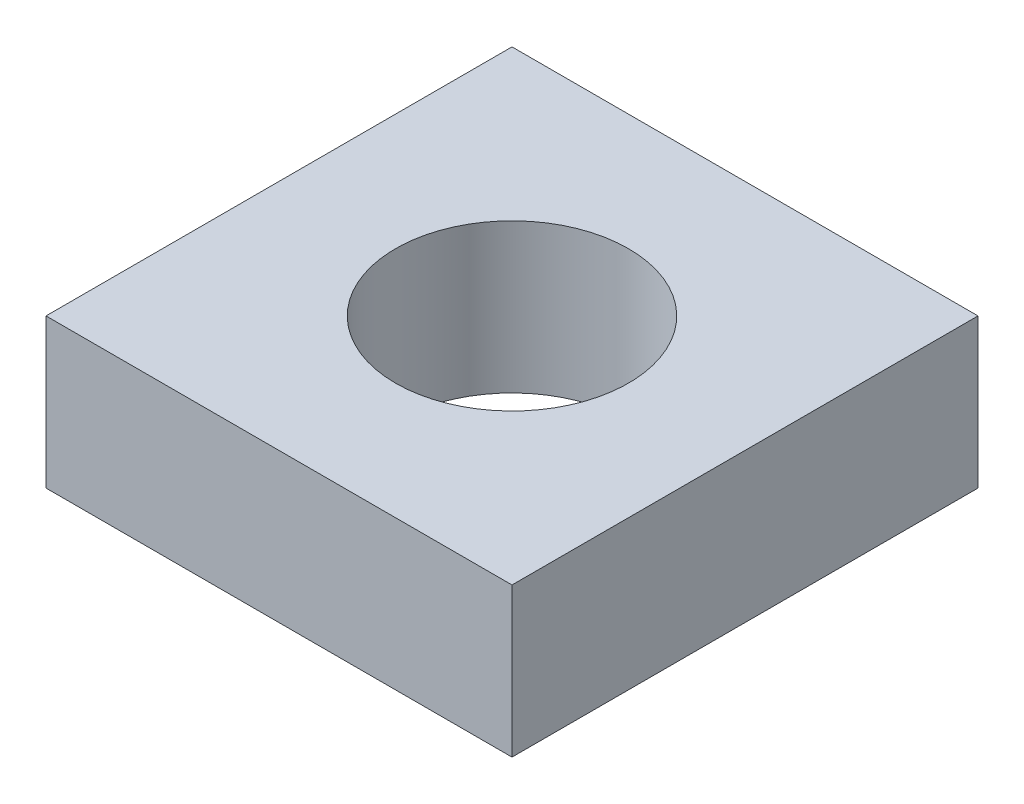
ISO-10303-21;
HEADER;
FILE_DESCRIPTION(('STEP AP214'),'2;1');
FILE_NAME('part.step','',(''),(''),'','','');
FILE_SCHEMA(('AUTOMOTIVE_DESIGN { 1 0 10303 214 1 1 1 1 }'));
ENDSEC;
DATA;
#1=APPLICATION_CONTEXT('core data for automotive mechanical design processes');
#2=APPLICATION_PROTOCOL_DEFINITION('international standard','automotive_design',2000,#1);
#3=PRODUCT_CONTEXT('',#1,'mechanical');
#4=PRODUCT('Part','Part','',(#3));
#5=PRODUCT_RELATED_PRODUCT_CATEGORY('part','',(#4));
#6=PRODUCT_DEFINITION_FORMATION('','',#4);
#7=PRODUCT_DEFINITION_CONTEXT('part definition',#1,'design');
#8=PRODUCT_DEFINITION('design','',#6,#7);
#9=PRODUCT_DEFINITION_SHAPE('','',#8);
#10=(LENGTH_UNIT() NAMED_UNIT(*) SI_UNIT(.MILLI.,.METRE.));
#11=(NAMED_UNIT(*) PLANE_ANGLE_UNIT() SI_UNIT($,.RADIAN.));
#12=(NAMED_UNIT(*) SI_UNIT($,.STERADIAN.) SOLID_ANGLE_UNIT());
#13=UNCERTAINTY_MEASURE_WITH_UNIT(LENGTH_MEASURE(1.E-05),#10,'distance_accuracy_value','');
#14=(GEOMETRIC_REPRESENTATION_CONTEXT(3) GLOBAL_UNCERTAINTY_ASSIGNED_CONTEXT((#13)) GLOBAL_UNIT_ASSIGNED_CONTEXT((#10,
#11,#12)) REPRESENTATION_CONTEXT('',''));
#15=CARTESIAN_POINT('',(0.,0.,0.));
#16=DIRECTION('',(0.,0.,1.));
#17=DIRECTION('',(1.,0.,0.));
#18=AXIS2_PLACEMENT_3D('',#15,#16,#17);
#19=CARTESIAN_POINT('',(0.,1.6,0.));
#20=DIRECTION('',(0.,1.,0.));
#21=DIRECTION('',(0.,0.,1.));
#22=AXIS2_PLACEMENT_3D('',#19,#20,#21);
#23=PLANE('',#22);
#24=DIRECTION('',(0.,0.,1.));
#25=VECTOR('',#24,1.);
#26=CARTESIAN_POINT('',(-2.5,1.6,2.5));
#27=LINE('',#26,#25);
#28=CARTESIAN_POINT('',(-2.5,1.6,-2.5));
#29=VERTEX_POINT('',#28);
#30=CARTESIAN_POINT('',(-2.5,1.6,2.5));
#31=VERTEX_POINT('',#30);
#32=EDGE_CURVE('E85',#29,#31,#27,.T.);
#33=ORIENTED_EDGE('',*,*,#32,.T.);
#34=DIRECTION('',(1.,0.,0.));
#35=VECTOR('',#34,1.);
#36=CARTESIAN_POINT('',(2.5,1.6,2.5));
#37=LINE('',#36,#35);
#38=CARTESIAN_POINT('',(2.5,1.6,2.5));
#39=VERTEX_POINT('',#38);
#40=EDGE_CURVE('E80',#31,#39,#37,.T.);
#41=ORIENTED_EDGE('',*,*,#40,.T.);
#42=DIRECTION('',(0.,0.,-1.));
#43=VECTOR('',#42,1.);
#44=CARTESIAN_POINT('',(2.5,1.6,2.5));
#45=LINE('',#44,#43);
#46=CARTESIAN_POINT('',(2.5,1.6,-2.5));
#47=VERTEX_POINT('',#46);
#48=EDGE_CURVE('E83',#39,#47,#45,.T.);
#49=ORIENTED_EDGE('',*,*,#48,.T.);
#50=DIRECTION('',(-1.,0.,0.));
#51=VECTOR('',#50,1.);
#52=CARTESIAN_POINT('',(2.5,1.6,-2.5));
#53=LINE('',#52,#51);
#54=EDGE_CURVE('E50',#47,#29,#53,.T.);
#55=ORIENTED_EDGE('',*,*,#54,.T.);
#56=EDGE_LOOP('',(#33,#41,#49,#55));
#57=FACE_BOUND('',#56,.T.);
#58=CARTESIAN_POINT('',(0.,1.6,0.));
#59=DIRECTION('',(0.,1.,0.));
#60=DIRECTION('',(0.,0.,1.));
#61=AXIS2_PLACEMENT_3D('',#58,#59,#60);
#62=CIRCLE('',#61,1.25);
#63=CARTESIAN_POINT('',(0.,1.6,1.25));
#64=VERTEX_POINT('',#63);
#65=EDGE_CURVE('E100',#64,#64,#62,.T.);
#66=ORIENTED_EDGE('',*,*,#65,.F.);
#67=EDGE_LOOP('',(#66));
#68=FACE_BOUND('',#67,.T.);
#69=ADVANCED_FACE('F33',(#57,#68),#23,.T.);
#70=CARTESIAN_POINT('',(0.,0.,0.));
#71=DIRECTION('',(0.,1.,0.));
#72=DIRECTION('',(0.,0.,1.));
#73=AXIS2_PLACEMENT_3D('',#70,#71,#72);
#74=PLANE('',#73);
#75=DIRECTION('',(0.,0.,1.));
#76=VECTOR('',#75,1.);
#77=CARTESIAN_POINT('',(-2.5,0.,2.5));
#78=LINE('',#77,#76);
#79=CARTESIAN_POINT('',(-2.5,0.,-2.5));
#80=VERTEX_POINT('',#79);
#81=CARTESIAN_POINT('',(-2.5,0.,2.5));
#82=VERTEX_POINT('',#81);
#83=EDGE_CURVE('E97',#80,#82,#78,.T.);
#84=ORIENTED_EDGE('',*,*,#83,.F.);
#85=DIRECTION('',(-1.,0.,0.));
#86=VECTOR('',#85,1.);
#87=CARTESIAN_POINT('',(2.5,0.,-2.5));
#88=LINE('',#87,#86);
#89=CARTESIAN_POINT('',(2.5,0.,-2.5));
#90=VERTEX_POINT('',#89);
#91=EDGE_CURVE('E73',#90,#80,#88,.T.);
#92=ORIENTED_EDGE('',*,*,#91,.F.);
#93=DIRECTION('',(0.,0.,-1.));
#94=VECTOR('',#93,1.);
#95=CARTESIAN_POINT('',(2.5,0.,2.5));
#96=LINE('',#95,#94);
#97=CARTESIAN_POINT('',(2.5,0.,2.5));
#98=VERTEX_POINT('',#97);
#99=EDGE_CURVE('E67',#98,#90,#96,.T.);
#100=ORIENTED_EDGE('',*,*,#99,.F.);
#101=DIRECTION('',(1.,0.,0.));
#102=VECTOR('',#101,1.);
#103=CARTESIAN_POINT('',(2.5,0.,2.5));
#104=LINE('',#103,#102);
#105=EDGE_CURVE('E89',#82,#98,#104,.T.);
#106=ORIENTED_EDGE('',*,*,#105,.F.);
#107=EDGE_LOOP('',(#84,#92,#100,#106));
#108=FACE_BOUND('',#107,.T.);
#109=CARTESIAN_POINT('',(0.,0.,0.));
#110=DIRECTION('',(0.,1.,0.));
#111=DIRECTION('',(0.,0.,1.));
#112=AXIS2_PLACEMENT_3D('',#109,#110,#111);
#113=CIRCLE('',#112,1.25);
#114=CARTESIAN_POINT('',(0.,0.,1.25));
#115=VERTEX_POINT('',#114);
#116=EDGE_CURVE('E112',#115,#115,#113,.T.);
#117=ORIENTED_EDGE('',*,*,#116,.T.);
#118=EDGE_LOOP('',(#117));
#119=FACE_BOUND('',#118,.T.);
#120=ADVANCED_FACE('F108',(#108,#119),#74,.F.);
#121=CARTESIAN_POINT('',(-2.5,1.6,2.5));
#122=DIRECTION('',(1.,0.,0.));
#123=DIRECTION('',(0.,0.,-1.));
#124=AXIS2_PLACEMENT_3D('',#121,#122,#123);
#125=PLANE('',#124);
#126=ORIENTED_EDGE('',*,*,#83,.T.);
#127=DIRECTION('',(0.,-1.,0.));
#128=VECTOR('',#127,1.);
#129=CARTESIAN_POINT('',(-2.5,1.6,2.5));
#130=LINE('',#129,#128);
#131=EDGE_CURVE('E11',#31,#82,#130,.T.);
#132=ORIENTED_EDGE('',*,*,#131,.F.);
#133=ORIENTED_EDGE('',*,*,#32,.F.);
#134=DIRECTION('',(0.,-1.,0.));
#135=VECTOR('',#134,1.);
#136=CARTESIAN_POINT('',(-2.5,1.6,-2.5));
#137=LINE('',#136,#135);
#138=EDGE_CURVE('E93',#29,#80,#137,.T.);
#139=ORIENTED_EDGE('',*,*,#138,.T.);
#140=EDGE_LOOP('',(#126,#132,#133,#139));
#141=FACE_BOUND('',#140,.T.);
#142=ADVANCED_FACE('F35',(#141),#125,.F.);
#143=CARTESIAN_POINT('',(2.5,1.6,2.5));
#144=DIRECTION('',(0.,0.,-1.));
#145=DIRECTION('',(-1.,0.,0.));
#146=AXIS2_PLACEMENT_3D('',#143,#144,#145);
#147=PLANE('',#146);
#148=ORIENTED_EDGE('',*,*,#105,.T.);
#149=DIRECTION('',(0.,-1.,0.));
#150=VECTOR('',#149,1.);
#151=CARTESIAN_POINT('',(2.5,1.6,2.5));
#152=LINE('',#151,#150);
#153=EDGE_CURVE('E42',#39,#98,#152,.T.);
#154=ORIENTED_EDGE('',*,*,#153,.F.);
#155=ORIENTED_EDGE('',*,*,#40,.F.);
#156=ORIENTED_EDGE('',*,*,#131,.T.);
#157=EDGE_LOOP('',(#148,#154,#155,#156));
#158=FACE_BOUND('',#157,.T.);
#159=ADVANCED_FACE('F88',(#158),#147,.F.);
#160=CARTESIAN_POINT('',(2.5,1.6,2.5));
#161=DIRECTION('',(-1.,0.,0.));
#162=DIRECTION('',(0.,0.,1.));
#163=AXIS2_PLACEMENT_3D('',#160,#161,#162);
#164=PLANE('',#163);
#165=ORIENTED_EDGE('',*,*,#99,.T.);
#166=DIRECTION('',(0.,-1.,0.));
#167=VECTOR('',#166,1.);
#168=CARTESIAN_POINT('',(2.5,1.6,-2.5));
#169=LINE('',#168,#167);
#170=EDGE_CURVE('E90',#47,#90,#169,.T.);
#171=ORIENTED_EDGE('',*,*,#170,.F.);
#172=ORIENTED_EDGE('',*,*,#48,.F.);
#173=ORIENTED_EDGE('',*,*,#153,.T.);
#174=EDGE_LOOP('',(#165,#171,#172,#173));
#175=FACE_BOUND('',#174,.T.);
#176=ADVANCED_FACE('F91',(#175),#164,.F.);
#177=CARTESIAN_POINT('',(2.5,1.6,-2.5));
#178=DIRECTION('',(0.,0.,1.));
#179=DIRECTION('',(1.,0.,0.));
#180=AXIS2_PLACEMENT_3D('',#177,#178,#179);
#181=PLANE('',#180);
#182=ORIENTED_EDGE('',*,*,#91,.T.);
#183=ORIENTED_EDGE('',*,*,#138,.F.);
#184=ORIENTED_EDGE('',*,*,#54,.F.);
#185=ORIENTED_EDGE('',*,*,#170,.T.);
#186=EDGE_LOOP('',(#182,#183,#184,#185));
#187=FACE_BOUND('',#186,.T.);
#188=ADVANCED_FACE('F105',(#187),#181,.F.);
#189=CARTESIAN_POINT('',(0.,1.6,0.));
#190=DIRECTION('',(0.,-1.,0.));
#191=DIRECTION('',(0.,0.,-1.));
#192=AXIS2_PLACEMENT_3D('',#189,#190,#191);
#193=CYLINDRICAL_SURFACE('',#192,1.25);
#194=ORIENTED_EDGE('',*,*,#65,.T.);
#195=EDGE_LOOP('',(#194));
#196=FACE_BOUND('',#195,.T.);
#197=ORIENTED_EDGE('',*,*,#116,.F.);
#198=EDGE_LOOP('',(#197));
#199=FACE_BOUND('',#198,.T.);
#200=ADVANCED_FACE('F118',(#196,#199),#193,.F.);
#201=CLOSED_SHELL('',(#69,#120,#142,#159,#176,#188,#200));
#202=MANIFOLD_SOLID_BREP('B2',#201);
#203=ADVANCED_BREP_SHAPE_REPRESENTATION('',(#18,#202),#14);
#204=SHAPE_DEFINITION_REPRESENTATION(#9,#203);
ENDSEC;
END-ISO-10303-21;
